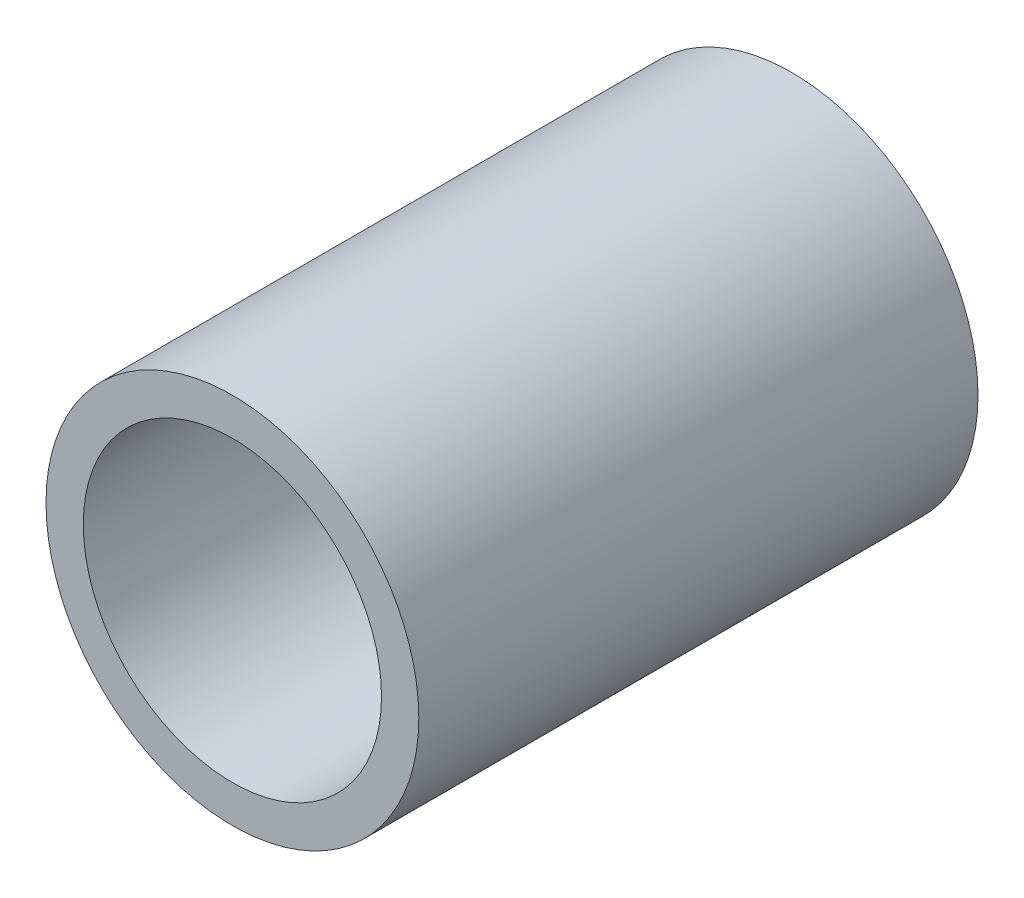
ISO-10303-21;
HEADER;
FILE_DESCRIPTION(('STEP AP214'),'2;1');
FILE_NAME('part.step','',(''),(''),'','','');
FILE_SCHEMA(('AUTOMOTIVE_DESIGN { 1 0 10303 214 1 1 1 1 }'));
ENDSEC;
DATA;
#1=APPLICATION_CONTEXT('core data for automotive mechanical design processes');
#2=APPLICATION_PROTOCOL_DEFINITION('international standard','automotive_design',2000,#1);
#3=PRODUCT_CONTEXT('',#1,'mechanical');
#4=PRODUCT('Part','Part','',(#3));
#5=PRODUCT_RELATED_PRODUCT_CATEGORY('part','',(#4));
#6=PRODUCT_DEFINITION_FORMATION('','',#4);
#7=PRODUCT_DEFINITION_CONTEXT('part definition',#1,'design');
#8=PRODUCT_DEFINITION('design','',#6,#7);
#9=PRODUCT_DEFINITION_SHAPE('','',#8);
#10=(LENGTH_UNIT() NAMED_UNIT(*) SI_UNIT(.MILLI.,.METRE.));
#11=(NAMED_UNIT(*) PLANE_ANGLE_UNIT() SI_UNIT($,.RADIAN.));
#12=(NAMED_UNIT(*) SI_UNIT($,.STERADIAN.) SOLID_ANGLE_UNIT());
#13=UNCERTAINTY_MEASURE_WITH_UNIT(LENGTH_MEASURE(1.E-05),#10,'distance_accuracy_value','');
#14=(GEOMETRIC_REPRESENTATION_CONTEXT(3) GLOBAL_UNCERTAINTY_ASSIGNED_CONTEXT((#13)) GLOBAL_UNIT_ASSIGNED_CONTEXT((#10,
#11,#12)) REPRESENTATION_CONTEXT('',''));
#15=CARTESIAN_POINT('',(0.,0.,0.));
#16=DIRECTION('',(0.,0.,1.));
#17=DIRECTION('',(1.,0.,0.));
#18=AXIS2_PLACEMENT_3D('',#15,#16,#17);
#19=CARTESIAN_POINT('',(0.,20.,15.));
#20=DIRECTION('',(0.,0.,-1.));
#21=DIRECTION('',(-1.,0.,0.));
#22=AXIS2_PLACEMENT_3D('',#19,#20,#21);
#23=CYLINDRICAL_SURFACE('',#22,8.);
#24=CARTESIAN_POINT('',(0.,20.,-15.));
#25=DIRECTION('',(0.,0.,-1.));
#26=DIRECTION('',(-1.,0.,0.));
#27=AXIS2_PLACEMENT_3D('',#24,#25,#26);
#28=CIRCLE('',#27,8.);
#29=CARTESIAN_POINT('',(-8.,20.,-15.));
#30=VERTEX_POINT('',#29);
#31=EDGE_CURVE('E27',#30,#30,#28,.T.);
#32=ORIENTED_EDGE('',*,*,#31,.T.);
#33=EDGE_LOOP('',(#32));
#34=FACE_BOUND('',#33,.T.);
#35=CARTESIAN_POINT('',(0.,20.,15.));
#36=DIRECTION('',(0.,0.,-1.));
#37=DIRECTION('',(-1.,0.,0.));
#38=AXIS2_PLACEMENT_3D('',#35,#36,#37);
#39=CIRCLE('',#38,8.);
#40=CARTESIAN_POINT('',(-8.,20.,15.));
#41=VERTEX_POINT('',#40);
#42=EDGE_CURVE('E18',#41,#41,#39,.T.);
#43=ORIENTED_EDGE('',*,*,#42,.F.);
#44=EDGE_LOOP('',(#43));
#45=FACE_BOUND('',#44,.T.);
#46=ADVANCED_FACE('F15',(#34,#45),#23,.F.);
#47=CARTESIAN_POINT('',(0.,20.,15.));
#48=DIRECTION('',(0.,0.,1.));
#49=DIRECTION('',(1.,0.,0.));
#50=AXIS2_PLACEMENT_3D('',#47,#48,#49);
#51=PLANE('',#50);
#52=ORIENTED_EDGE('',*,*,#42,.T.);
#53=EDGE_LOOP('',(#52));
#54=FACE_BOUND('',#53,.T.);
#55=CARTESIAN_POINT('',(0.,20.,15.));
#56=DIRECTION('',(0.,0.,-1.));
#57=DIRECTION('',(-1.,0.,0.));
#58=AXIS2_PLACEMENT_3D('',#55,#56,#57);
#59=CIRCLE('',#58,10.);
#60=CARTESIAN_POINT('',(-10.,20.,15.));
#61=VERTEX_POINT('',#60);
#62=EDGE_CURVE('E22',#61,#61,#59,.T.);
#63=ORIENTED_EDGE('',*,*,#62,.F.);
#64=EDGE_LOOP('',(#63));
#65=FACE_BOUND('',#64,.T.);
#66=ADVANCED_FACE('F35',(#54,#65),#51,.T.);
#67=CARTESIAN_POINT('',(0.,20.,-15.));
#68=DIRECTION('',(0.,0.,1.));
#69=DIRECTION('',(1.,0.,0.));
#70=AXIS2_PLACEMENT_3D('',#67,#68,#69);
#71=PLANE('',#70);
#72=ORIENTED_EDGE('',*,*,#31,.F.);
#73=EDGE_LOOP('',(#72));
#74=FACE_BOUND('',#73,.T.);
#75=CARTESIAN_POINT('',(0.,20.,-15.));
#76=DIRECTION('',(0.,0.,-1.));
#77=DIRECTION('',(-1.,0.,0.));
#78=AXIS2_PLACEMENT_3D('',#75,#76,#77);
#79=CIRCLE('',#78,10.);
#80=CARTESIAN_POINT('',(-10.,20.,-15.));
#81=VERTEX_POINT('',#80);
#82=EDGE_CURVE('E10',#81,#81,#79,.F.);
#83=ORIENTED_EDGE('',*,*,#82,.F.);
#84=EDGE_LOOP('',(#83));
#85=FACE_BOUND('',#84,.T.);
#86=ADVANCED_FACE('F43',(#74,#85),#71,.F.);
#87=CARTESIAN_POINT('',(0.,20.,15.));
#88=DIRECTION('',(0.,0.,-1.));
#89=DIRECTION('',(-1.,0.,0.));
#90=AXIS2_PLACEMENT_3D('',#87,#88,#89);
#91=CYLINDRICAL_SURFACE('',#90,10.);
#92=ORIENTED_EDGE('',*,*,#82,.T.);
#93=EDGE_LOOP('',(#92));
#94=FACE_BOUND('',#93,.T.);
#95=ORIENTED_EDGE('',*,*,#62,.T.);
#96=EDGE_LOOP('',(#95));
#97=FACE_BOUND('',#96,.T.);
#98=ADVANCED_FACE('F44',(#94,#97),#91,.T.);
#99=CLOSED_SHELL('',(#46,#66,#86,#98));
#100=MANIFOLD_SOLID_BREP('B1',#99);
#101=ADVANCED_BREP_SHAPE_REPRESENTATION('',(#18,#100),#14);
#102=SHAPE_DEFINITION_REPRESENTATION(#9,#101);
ENDSEC;
END-ISO-10303-21;
